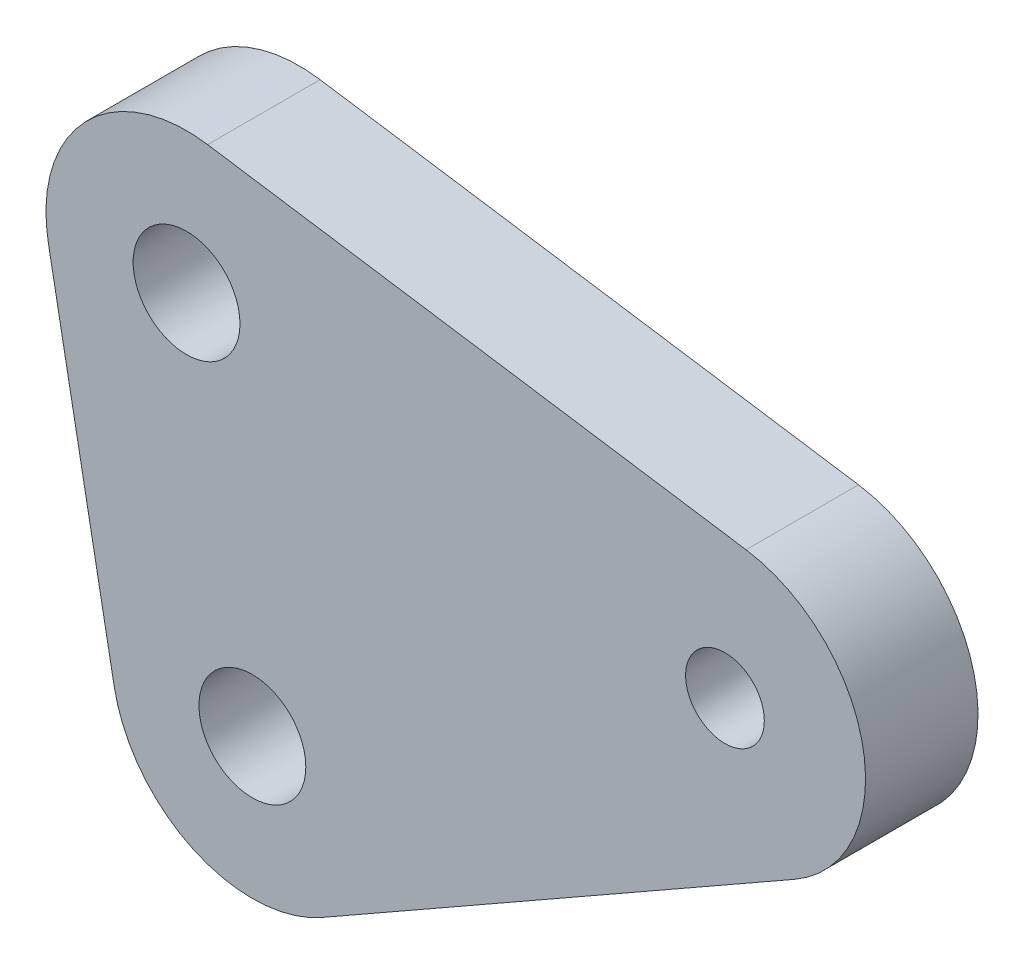
ISO-10303-21;
HEADER;
FILE_DESCRIPTION(('STEP AP214'),'2;1');
FILE_NAME('part.step','',(''),(''),'','','');
FILE_SCHEMA(('AUTOMOTIVE_DESIGN { 1 0 10303 214 1 1 1 1 }'));
ENDSEC;
DATA;
#1=APPLICATION_CONTEXT('core data for automotive mechanical design processes');
#2=APPLICATION_PROTOCOL_DEFINITION('international standard','automotive_design',2000,#1);
#3=PRODUCT_CONTEXT('',#1,'mechanical');
#4=PRODUCT('Part','Part','',(#3));
#5=PRODUCT_RELATED_PRODUCT_CATEGORY('part','',(#4));
#6=PRODUCT_DEFINITION_FORMATION('','',#4);
#7=PRODUCT_DEFINITION_CONTEXT('part definition',#1,'design');
#8=PRODUCT_DEFINITION('design','',#6,#7);
#9=PRODUCT_DEFINITION_SHAPE('','',#8);
#10=(LENGTH_UNIT() NAMED_UNIT(*) SI_UNIT(.MILLI.,.METRE.));
#11=(NAMED_UNIT(*) PLANE_ANGLE_UNIT() SI_UNIT($,.RADIAN.));
#12=(NAMED_UNIT(*) SI_UNIT($,.STERADIAN.) SOLID_ANGLE_UNIT());
#13=UNCERTAINTY_MEASURE_WITH_UNIT(LENGTH_MEASURE(1.E-05),#10,'distance_accuracy_value','');
#14=(GEOMETRIC_REPRESENTATION_CONTEXT(3) GLOBAL_UNCERTAINTY_ASSIGNED_CONTEXT((#13)) GLOBAL_UNIT_ASSIGNED_CONTEXT((#10,
#11,#12)) REPRESENTATION_CONTEXT('',''));
#15=CARTESIAN_POINT('',(0.,0.,0.));
#16=DIRECTION('',(0.,0.,1.));
#17=DIRECTION('',(1.,0.,0.));
#18=AXIS2_PLACEMENT_3D('',#15,#16,#17);
#19=CARTESIAN_POINT('',(26.1417069884607,72.0991364238817,4.));
#20=DIRECTION('',(0.,0.,1.));
#21=DIRECTION('',(1.,0.,0.));
#22=AXIS2_PLACEMENT_3D('',#19,#20,#21);
#23=PLANE('',#22);
#24=CARTESIAN_POINT('',(28.4825600069119,59.6183393892521,4.));
#25=DIRECTION('',(0.,0.,1.));
#26=DIRECTION('',(1.,0.,0.));
#27=AXIS2_PLACEMENT_3D('',#24,#25,#26);
#28=CIRCLE('',#27,1.9);
#29=CARTESIAN_POINT('',(30.3825600069119,59.6183393892521,4.));
#30=VERTEX_POINT('',#29);
#31=EDGE_CURVE('E186',#30,#30,#28,.T.);
#32=ORIENTED_EDGE('',*,*,#31,.F.);
#33=EDGE_LOOP('',(#32));
#34=FACE_BOUND('',#33,.T.);
#35=CARTESIAN_POINT('',(26.1417069884607,72.0991364238817,4.));
#36=DIRECTION('',(0.,0.,1.));
#37=DIRECTION('',(1.,0.,0.));
#38=AXIS2_PLACEMENT_3D('',#35,#36,#37);
#39=CIRCLE('',#38,5.);
#40=CARTESIAN_POINT('',(26.891590001168,77.042584154692,4.));
#41=VERTEX_POINT('',#40);
#42=CARTESIAN_POINT('',(21.227396240506,71.1774261263712,4.));
#43=VERTEX_POINT('',#42);
#44=EDGE_CURVE('E131',#41,#43,#39,.T.);
#45=ORIENTED_EDGE('',*,*,#44,.T.);
#46=DIRECTION('',(0.184342059502102,-0.98286214959094,0.));
#47=VECTOR('',#46,1.);
#48=CARTESIAN_POINT('',(21.227396240506,71.1774261263712,4.));
#49=LINE('',#48,#47);
#50=CARTESIAN_POINT('',(23.5682492589572,58.6966290917416,4.));
#51=VERTEX_POINT('',#50);
#52=EDGE_CURVE('E89',#43,#51,#49,.T.);
#53=ORIENTED_EDGE('',*,*,#52,.T.);
#54=CARTESIAN_POINT('',(28.4825600069119,59.6183393892521,4.));
#55=DIRECTION('',(0.,0.,1.));
#56=DIRECTION('',(1.,0.,0.));
#57=AXIS2_PLACEMENT_3D('',#54,#55,#56);
#58=CIRCLE('',#57,5.);
#59=CARTESIAN_POINT('',(30.9580435209812,55.2741500089912,4.));
#60=VERTEX_POINT('',#59);
#61=EDGE_CURVE('E102',#51,#60,#58,.T.);
#62=ORIENTED_EDGE('',*,*,#61,.T.);
#63=DIRECTION('',(0.86883787605217,0.495096702813858,0.));
#64=VECTOR('',#63,1.);
#65=CARTESIAN_POINT('',(30.9580435209812,55.2741500089912,4.));
#66=LINE('',#65,#64);
#67=CARTESIAN_POINT('',(47.7635886864171,64.8505856475972,4.));
#68=VERTEX_POINT('',#67);
#69=EDGE_CURVE('E96',#60,#68,#66,.T.);
#70=ORIENTED_EDGE('',*,*,#69,.T.);
#71=CARTESIAN_POINT('',(45.2881051723479,69.194775027858,4.));
#72=DIRECTION('',(0.,0.,1.));
#73=DIRECTION('',(1.,0.,0.));
#74=AXIS2_PLACEMENT_3D('',#71,#72,#73);
#75=CIRCLE('',#74,5.);
#76=CARTESIAN_POINT('',(46.0379881850551,74.1382227586683,4.));
#77=VERTEX_POINT('',#76);
#78=EDGE_CURVE('E100',#68,#77,#75,.T.);
#79=ORIENTED_EDGE('',*,*,#78,.T.);
#80=DIRECTION('',(-0.988689546162052,0.149976602541452,0.));
#81=VECTOR('',#80,1.);
#82=CARTESIAN_POINT('',(26.891590001168,77.042584154692,4.));
#83=LINE('',#82,#81);
#84=EDGE_CURVE('E52',#77,#41,#83,.T.);
#85=ORIENTED_EDGE('',*,*,#84,.T.);
#86=EDGE_LOOP('',(#45,#53,#62,#70,#79,#85));
#87=FACE_BOUND('',#86,.T.);
#88=CARTESIAN_POINT('',(26.1417069884607,72.0991364238817,4.));
#89=DIRECTION('',(0.,0.,1.));
#90=DIRECTION('',(1.,0.,0.));
#91=AXIS2_PLACEMENT_3D('',#88,#89,#90);
#92=CIRCLE('',#91,1.9);
#93=CARTESIAN_POINT('',(28.0417069884607,72.0991364238817,4.));
#94=VERTEX_POINT('',#93);
#95=EDGE_CURVE('E124',#94,#94,#92,.T.);
#96=ORIENTED_EDGE('',*,*,#95,.F.);
#97=EDGE_LOOP('',(#96));
#98=FACE_BOUND('',#97,.T.);
#99=CARTESIAN_POINT('',(45.2881051723479,69.194775027858,4.));
#100=DIRECTION('',(0.,0.,1.));
#101=DIRECTION('',(1.,0.,0.));
#102=AXIS2_PLACEMENT_3D('',#99,#100,#101);
#103=CIRCLE('',#102,1.4);
#104=CARTESIAN_POINT('',(46.6881051723479,69.194775027858,4.));
#105=VERTEX_POINT('',#104);
#106=EDGE_CURVE('E177',#105,#105,#103,.T.);
#107=ORIENTED_EDGE('',*,*,#106,.F.);
#108=EDGE_LOOP('',(#107));
#109=FACE_BOUND('',#108,.T.);
#110=ADVANCED_FACE('F35',(#34,#87,#98,#109),#23,.T.);
#111=CARTESIAN_POINT('',(26.1417069884607,72.0991364238817,0.));
#112=DIRECTION('',(0.,0.,1.));
#113=DIRECTION('',(1.,0.,0.));
#114=AXIS2_PLACEMENT_3D('',#111,#112,#113);
#115=PLANE('',#114);
#116=CARTESIAN_POINT('',(26.1417069884607,72.0991364238817,0.));
#117=DIRECTION('',(0.,0.,1.));
#118=DIRECTION('',(1.,0.,0.));
#119=AXIS2_PLACEMENT_3D('',#116,#117,#118);
#120=CIRCLE('',#119,5.);
#121=CARTESIAN_POINT('',(26.891590001168,77.042584154692,0.));
#122=VERTEX_POINT('',#121);
#123=CARTESIAN_POINT('',(21.227396240506,71.1774261263712,0.));
#124=VERTEX_POINT('',#123);
#125=EDGE_CURVE('E120',#122,#124,#120,.T.);
#126=ORIENTED_EDGE('',*,*,#125,.F.);
#127=DIRECTION('',(-0.988689546162052,0.149976602541452,0.));
#128=VECTOR('',#127,1.);
#129=CARTESIAN_POINT('',(26.891590001168,77.042584154692,0.));
#130=LINE('',#129,#128);
#131=CARTESIAN_POINT('',(46.0379881850551,74.1382227586683,0.));
#132=VERTEX_POINT('',#131);
#133=EDGE_CURVE('E81',#132,#122,#130,.T.);
#134=ORIENTED_EDGE('',*,*,#133,.F.);
#135=CARTESIAN_POINT('',(45.2881051723479,69.194775027858,0.));
#136=DIRECTION('',(0.,0.,1.));
#137=DIRECTION('',(1.,0.,0.));
#138=AXIS2_PLACEMENT_3D('',#135,#136,#137);
#139=CIRCLE('',#138,5.);
#140=CARTESIAN_POINT('',(47.7635886864171,64.8505856475972,0.));
#141=VERTEX_POINT('',#140);
#142=EDGE_CURVE('E75',#141,#132,#139,.T.);
#143=ORIENTED_EDGE('',*,*,#142,.F.);
#144=DIRECTION('',(0.86883787605217,0.495096702813858,0.));
#145=VECTOR('',#144,1.);
#146=CARTESIAN_POINT('',(30.9580435209812,55.2741500089912,0.));
#147=LINE('',#146,#145);
#148=CARTESIAN_POINT('',(30.9580435209812,55.2741500089912,0.));
#149=VERTEX_POINT('',#148);
#150=EDGE_CURVE('E110',#149,#141,#147,.T.);
#151=ORIENTED_EDGE('',*,*,#150,.F.);
#152=CARTESIAN_POINT('',(28.4825600069119,59.6183393892521,0.));
#153=DIRECTION('',(0.,0.,1.));
#154=DIRECTION('',(1.,0.,0.));
#155=AXIS2_PLACEMENT_3D('',#152,#153,#154);
#156=CIRCLE('',#155,5.);
#157=CARTESIAN_POINT('',(23.5682492589572,58.6966290917416,0.));
#158=VERTEX_POINT('',#157);
#159=EDGE_CURVE('E126',#158,#149,#156,.T.);
#160=ORIENTED_EDGE('',*,*,#159,.F.);
#161=DIRECTION('',(0.184342059502102,-0.98286214959094,0.));
#162=VECTOR('',#161,1.);
#163=CARTESIAN_POINT('',(21.227396240506,71.1774261263712,0.));
#164=LINE('',#163,#162);
#165=EDGE_CURVE('E123',#124,#158,#164,.T.);
#166=ORIENTED_EDGE('',*,*,#165,.F.);
#167=EDGE_LOOP('',(#126,#134,#143,#151,#160,#166));
#168=FACE_BOUND('',#167,.T.);
#169=CARTESIAN_POINT('',(26.1417069884607,72.0991364238817,0.));
#170=DIRECTION('',(0.,0.,1.));
#171=DIRECTION('',(1.,0.,0.));
#172=AXIS2_PLACEMENT_3D('',#169,#170,#171);
#173=CIRCLE('',#172,1.9);
#174=CARTESIAN_POINT('',(28.0417069884607,72.0991364238817,0.));
#175=VERTEX_POINT('',#174);
#176=EDGE_CURVE('E189',#175,#175,#173,.T.);
#177=ORIENTED_EDGE('',*,*,#176,.T.);
#178=EDGE_LOOP('',(#177));
#179=FACE_BOUND('',#178,.T.);
#180=CARTESIAN_POINT('',(28.4825600069119,59.6183393892521,0.));
#181=DIRECTION('',(0.,0.,1.));
#182=DIRECTION('',(1.,0.,0.));
#183=AXIS2_PLACEMENT_3D('',#180,#181,#182);
#184=CIRCLE('',#183,1.9);
#185=CARTESIAN_POINT('',(30.3825600069119,59.6183393892521,0.));
#186=VERTEX_POINT('',#185);
#187=EDGE_CURVE('E183',#186,#186,#184,.T.);
#188=ORIENTED_EDGE('',*,*,#187,.T.);
#189=EDGE_LOOP('',(#188));
#190=FACE_BOUND('',#189,.T.);
#191=CARTESIAN_POINT('',(45.2881051723479,69.194775027858,0.));
#192=DIRECTION('',(0.,0.,1.));
#193=DIRECTION('',(1.,0.,0.));
#194=AXIS2_PLACEMENT_3D('',#191,#192,#193);
#195=CIRCLE('',#194,1.4);
#196=CARTESIAN_POINT('',(46.6881051723479,69.194775027858,0.));
#197=VERTEX_POINT('',#196);
#198=EDGE_CURVE('E180',#197,#197,#195,.T.);
#199=ORIENTED_EDGE('',*,*,#198,.T.);
#200=EDGE_LOOP('',(#199));
#201=FACE_BOUND('',#200,.T.);
#202=ADVANCED_FACE('F140',(#168,#179,#190,#201),#115,.F.);
#203=CARTESIAN_POINT('',(26.1417069884607,72.0991364238817,4.));
#204=DIRECTION('',(0.,0.,-1.));
#205=DIRECTION('',(-1.,0.,0.));
#206=AXIS2_PLACEMENT_3D('',#203,#204,#205);
#207=CYLINDRICAL_SURFACE('',#206,5.);
#208=ORIENTED_EDGE('',*,*,#125,.T.);
#209=DIRECTION('',(0.,0.,-1.));
#210=VECTOR('',#209,1.);
#211=CARTESIAN_POINT('',(21.227396240506,71.1774261263712,4.));
#212=LINE('',#211,#210);
#213=EDGE_CURVE('E11',#43,#124,#212,.T.);
#214=ORIENTED_EDGE('',*,*,#213,.F.);
#215=ORIENTED_EDGE('',*,*,#44,.F.);
#216=DIRECTION('',(0.,0.,-1.));
#217=VECTOR('',#216,1.);
#218=CARTESIAN_POINT('',(26.891590001168,77.042584154692,4.));
#219=LINE('',#218,#217);
#220=EDGE_CURVE('E116',#41,#122,#219,.T.);
#221=ORIENTED_EDGE('',*,*,#220,.T.);
#222=EDGE_LOOP('',(#208,#214,#215,#221));
#223=FACE_BOUND('',#222,.T.);
#224=ADVANCED_FACE('F37',(#223),#207,.T.);
#225=CARTESIAN_POINT('',(21.227396240506,71.1774261263712,4.));
#226=DIRECTION('',(0.98286214959094,0.184342059502102,0.));
#227=DIRECTION('',(-0.184342059502102,0.98286214959094,0.));
#228=AXIS2_PLACEMENT_3D('',#225,#226,#227);
#229=PLANE('',#228);
#230=ORIENTED_EDGE('',*,*,#165,.T.);
#231=DIRECTION('',(0.,0.,-1.));
#232=VECTOR('',#231,1.);
#233=CARTESIAN_POINT('',(23.5682492589572,58.6966290917416,4.));
#234=LINE('',#233,#232);
#235=EDGE_CURVE('E44',#51,#158,#234,.T.);
#236=ORIENTED_EDGE('',*,*,#235,.F.);
#237=ORIENTED_EDGE('',*,*,#52,.F.);
#238=ORIENTED_EDGE('',*,*,#213,.T.);
#239=EDGE_LOOP('',(#230,#236,#237,#238));
#240=FACE_BOUND('',#239,.T.);
#241=ADVANCED_FACE('F239',(#240),#229,.F.);
#242=CARTESIAN_POINT('',(28.4825600069119,59.6183393892521,4.));
#243=DIRECTION('',(0.,0.,-1.));
#244=DIRECTION('',(-1.,0.,0.));
#245=AXIS2_PLACEMENT_3D('',#242,#243,#244);
#246=CYLINDRICAL_SURFACE('',#245,5.);
#247=ORIENTED_EDGE('',*,*,#159,.T.);
#248=DIRECTION('',(0.,0.,-1.));
#249=VECTOR('',#248,1.);
#250=CARTESIAN_POINT('',(30.9580435209812,55.2741500089912,4.));
#251=LINE('',#250,#249);
#252=EDGE_CURVE('E111',#60,#149,#251,.T.);
#253=ORIENTED_EDGE('',*,*,#252,.F.);
#254=ORIENTED_EDGE('',*,*,#61,.F.);
#255=ORIENTED_EDGE('',*,*,#235,.T.);
#256=EDGE_LOOP('',(#247,#253,#254,#255));
#257=FACE_BOUND('',#256,.T.);
#258=ADVANCED_FACE('F137',(#257),#246,.T.);
#259=CARTESIAN_POINT('',(30.9580435209812,55.2741500089912,4.));
#260=DIRECTION('',(-0.495096702813858,0.86883787605217,0.));
#261=DIRECTION('',(-0.86883787605217,-0.495096702813858,0.));
#262=AXIS2_PLACEMENT_3D('',#259,#260,#261);
#263=PLANE('',#262);
#264=ORIENTED_EDGE('',*,*,#150,.T.);
#265=DIRECTION('',(0.,0.,-1.));
#266=VECTOR('',#265,1.);
#267=CARTESIAN_POINT('',(47.7635886864171,64.8505856475972,4.));
#268=LINE('',#267,#266);
#269=EDGE_CURVE('E107',#68,#141,#268,.T.);
#270=ORIENTED_EDGE('',*,*,#269,.F.);
#271=ORIENTED_EDGE('',*,*,#69,.F.);
#272=ORIENTED_EDGE('',*,*,#252,.T.);
#273=EDGE_LOOP('',(#264,#270,#271,#272));
#274=FACE_BOUND('',#273,.T.);
#275=ADVANCED_FACE('F108',(#274),#263,.F.);
#276=CARTESIAN_POINT('',(45.2881051723479,69.194775027858,4.));
#277=DIRECTION('',(0.,0.,-1.));
#278=DIRECTION('',(-1.,0.,0.));
#279=AXIS2_PLACEMENT_3D('',#276,#277,#278);
#280=CYLINDRICAL_SURFACE('',#279,5.);
#281=ORIENTED_EDGE('',*,*,#142,.T.);
#282=DIRECTION('',(0.,0.,-1.));
#283=VECTOR('',#282,1.);
#284=CARTESIAN_POINT('',(46.0379881850551,74.1382227586683,4.));
#285=LINE('',#284,#283);
#286=EDGE_CURVE('E112',#77,#132,#285,.T.);
#287=ORIENTED_EDGE('',*,*,#286,.F.);
#288=ORIENTED_EDGE('',*,*,#78,.F.);
#289=ORIENTED_EDGE('',*,*,#269,.T.);
#290=EDGE_LOOP('',(#281,#287,#288,#289));
#291=FACE_BOUND('',#290,.T.);
#292=ADVANCED_FACE('F114',(#291),#280,.T.);
#293=CARTESIAN_POINT('',(26.891590001168,77.042584154692,4.));
#294=DIRECTION('',(-0.149976602541452,-0.988689546162052,0.));
#295=DIRECTION('',(0.988689546162052,-0.149976602541452,0.));
#296=AXIS2_PLACEMENT_3D('',#293,#294,#295);
#297=PLANE('',#296);
#298=ORIENTED_EDGE('',*,*,#133,.T.);
#299=ORIENTED_EDGE('',*,*,#220,.F.);
#300=ORIENTED_EDGE('',*,*,#84,.F.);
#301=ORIENTED_EDGE('',*,*,#286,.T.);
#302=EDGE_LOOP('',(#298,#299,#300,#301));
#303=FACE_BOUND('',#302,.T.);
#304=ADVANCED_FACE('F145',(#303),#297,.F.);
#305=CARTESIAN_POINT('',(26.1417069884607,72.0991364238817,4.));
#306=DIRECTION('',(0.,0.,-1.));
#307=DIRECTION('',(-1.,0.,0.));
#308=AXIS2_PLACEMENT_3D('',#305,#306,#307);
#309=CYLINDRICAL_SURFACE('',#308,1.9);
#310=ORIENTED_EDGE('',*,*,#95,.T.);
#311=EDGE_LOOP('',(#310));
#312=FACE_BOUND('',#311,.T.);
#313=ORIENTED_EDGE('',*,*,#176,.F.);
#314=EDGE_LOOP('',(#313));
#315=FACE_BOUND('',#314,.T.);
#316=ADVANCED_FACE('F147',(#312,#315),#309,.F.);
#317=CARTESIAN_POINT('',(28.4825600069119,59.6183393892521,4.));
#318=DIRECTION('',(0.,0.,-1.));
#319=DIRECTION('',(-1.,0.,0.));
#320=AXIS2_PLACEMENT_3D('',#317,#318,#319);
#321=CYLINDRICAL_SURFACE('',#320,1.9);
#322=ORIENTED_EDGE('',*,*,#31,.T.);
#323=EDGE_LOOP('',(#322));
#324=FACE_BOUND('',#323,.T.);
#325=ORIENTED_EDGE('',*,*,#187,.F.);
#326=EDGE_LOOP('',(#325));
#327=FACE_BOUND('',#326,.T.);
#328=ADVANCED_FACE('F153',(#324,#327),#321,.F.);
#329=CARTESIAN_POINT('',(45.2881051723479,69.194775027858,4.));
#330=DIRECTION('',(0.,0.,-1.));
#331=DIRECTION('',(-1.,0.,0.));
#332=AXIS2_PLACEMENT_3D('',#329,#330,#331);
#333=CYLINDRICAL_SURFACE('',#332,1.4);
#334=ORIENTED_EDGE('',*,*,#106,.T.);
#335=EDGE_LOOP('',(#334));
#336=FACE_BOUND('',#335,.T.);
#337=ORIENTED_EDGE('',*,*,#198,.F.);
#338=EDGE_LOOP('',(#337));
#339=FACE_BOUND('',#338,.T.);
#340=ADVANCED_FACE('F168',(#336,#339),#333,.F.);
#341=CLOSED_SHELL('',(#110,#202,#224,#241,#258,#275,#292,#304,#316,#328,#340));
#342=MANIFOLD_SOLID_BREP('B2',#341);
#343=ADVANCED_BREP_SHAPE_REPRESENTATION('',(#18,#342),#14);
#344=SHAPE_DEFINITION_REPRESENTATION(#9,#343);
ENDSEC;
END-ISO-10303-21;
